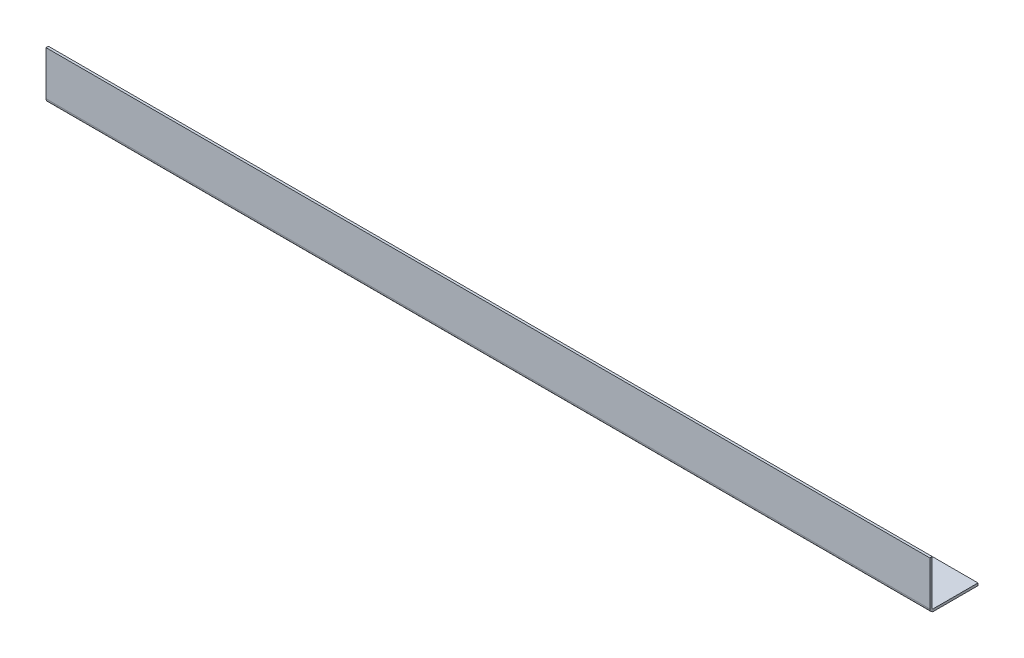
ISO-10303-21;
HEADER;
FILE_DESCRIPTION(('STEP AP214'),'2;1');
FILE_NAME('part.step','',(''),(''),'','','');
FILE_SCHEMA(('AUTOMOTIVE_DESIGN { 1 0 10303 214 1 1 1 1 }'));
ENDSEC;
DATA;
#1=APPLICATION_CONTEXT('core data for automotive mechanical design processes');
#2=APPLICATION_PROTOCOL_DEFINITION('international standard','automotive_design',2000,#1);
#3=PRODUCT_CONTEXT('',#1,'mechanical');
#4=PRODUCT('Part','Part','',(#3));
#5=PRODUCT_RELATED_PRODUCT_CATEGORY('part','',(#4));
#6=PRODUCT_DEFINITION_FORMATION('','',#4);
#7=PRODUCT_DEFINITION_CONTEXT('part definition',#1,'design');
#8=PRODUCT_DEFINITION('design','',#6,#7);
#9=PRODUCT_DEFINITION_SHAPE('','',#8);
#10=(LENGTH_UNIT() NAMED_UNIT(*) SI_UNIT(.MILLI.,.METRE.));
#11=(NAMED_UNIT(*) PLANE_ANGLE_UNIT() SI_UNIT($,.RADIAN.));
#12=(NAMED_UNIT(*) SI_UNIT($,.STERADIAN.) SOLID_ANGLE_UNIT());
#13=UNCERTAINTY_MEASURE_WITH_UNIT(LENGTH_MEASURE(1.E-05),#10,'distance_accuracy_value','');
#14=(GEOMETRIC_REPRESENTATION_CONTEXT(3) GLOBAL_UNCERTAINTY_ASSIGNED_CONTEXT((#13)) GLOBAL_UNIT_ASSIGNED_CONTEXT((#10,
#11,#12)) REPRESENTATION_CONTEXT('',''));
#15=CARTESIAN_POINT('',(0.,0.,0.));
#16=DIRECTION('',(0.,0.,1.));
#17=DIRECTION('',(1.,0.,0.));
#18=AXIS2_PLACEMENT_3D('',#15,#16,#17);
#19=CARTESIAN_POINT('',(550.,0.,0.));
#20=DIRECTION('',(0.,1.,0.));
#21=DIRECTION('',(0.,0.,1.));
#22=AXIS2_PLACEMENT_3D('',#19,#20,#21);
#23=PLANE('',#22);
#24=DIRECTION('',(0.,0.,-1.));
#25=VECTOR('',#24,1.);
#26=CARTESIAN_POINT('',(550.,0.,0.));
#27=LINE('',#26,#25);
#28=CARTESIAN_POINT('',(550.,0.,-5.));
#29=VERTEX_POINT('',#28);
#30=CARTESIAN_POINT('',(550.,0.,-60.));
#31=VERTEX_POINT('',#30);
#32=EDGE_CURVE('E97',#29,#31,#27,.T.);
#33=ORIENTED_EDGE('',*,*,#32,.F.);
#34=DIRECTION('',(-1.,0.,0.));
#35=VECTOR('',#34,1.);
#36=CARTESIAN_POINT('',(550.,0.,-5.));
#37=LINE('',#36,#35);
#38=CARTESIAN_POINT('',(-550.,0.,-5.));
#39=VERTEX_POINT('',#38);
#40=EDGE_CURVE('E122',#29,#39,#37,.T.);
#41=ORIENTED_EDGE('',*,*,#40,.T.);
#42=DIRECTION('',(0.,0.,-1.));
#43=VECTOR('',#42,1.);
#44=CARTESIAN_POINT('',(-550.,0.,0.));
#45=LINE('',#44,#43);
#46=CARTESIAN_POINT('',(-550.,0.,-60.));
#47=VERTEX_POINT('',#46);
#48=EDGE_CURVE('E120',#39,#47,#45,.T.);
#49=ORIENTED_EDGE('',*,*,#48,.T.);
#50=DIRECTION('',(-1.,0.,0.));
#51=VECTOR('',#50,1.);
#52=CARTESIAN_POINT('',(550.,0.,-60.));
#53=LINE('',#52,#51);
#54=EDGE_CURVE('E114',#31,#47,#53,.T.);
#55=ORIENTED_EDGE('',*,*,#54,.F.);
#56=EDGE_LOOP('',(#33,#41,#49,#55));
#57=FACE_BOUND('',#56,.T.);
#58=ADVANCED_FACE('F33',(#57),#23,.F.);
#59=CARTESIAN_POINT('',(550.,0.,-60.));
#60=DIRECTION('',(0.,0.,1.));
#61=DIRECTION('',(1.,0.,0.));
#62=AXIS2_PLACEMENT_3D('',#59,#60,#61);
#63=PLANE('',#62);
#64=DIRECTION('',(0.,1.,0.));
#65=VECTOR('',#64,1.);
#66=CARTESIAN_POINT('',(-550.,0.,-60.));
#67=LINE('',#66,#65);
#68=CARTESIAN_POINT('',(-550.,3.,-60.));
#69=VERTEX_POINT('',#68);
#70=EDGE_CURVE('E154',#47,#69,#67,.T.);
#71=ORIENTED_EDGE('',*,*,#70,.T.);
#72=DIRECTION('',(-1.,0.,0.));
#73=VECTOR('',#72,1.);
#74=CARTESIAN_POINT('',(550.,3.,-60.));
#75=LINE('',#74,#73);
#76=CARTESIAN_POINT('',(550.,3.,-60.));
#77=VERTEX_POINT('',#76);
#78=EDGE_CURVE('E116',#77,#69,#75,.T.);
#79=ORIENTED_EDGE('',*,*,#78,.F.);
#80=DIRECTION('',(0.,1.,0.));
#81=VECTOR('',#80,1.);
#82=CARTESIAN_POINT('',(550.,0.,-60.));
#83=LINE('',#82,#81);
#84=EDGE_CURVE('E101',#31,#77,#83,.T.);
#85=ORIENTED_EDGE('',*,*,#84,.F.);
#86=ORIENTED_EDGE('',*,*,#54,.T.);
#87=EDGE_LOOP('',(#71,#79,#85,#86));
#88=FACE_BOUND('',#87,.T.);
#89=ADVANCED_FACE('F113',(#88),#63,.F.);
#90=CARTESIAN_POINT('',(550.,3.,-60.));
#91=DIRECTION('',(0.,-1.,0.));
#92=DIRECTION('',(0.,0.,-1.));
#93=AXIS2_PLACEMENT_3D('',#90,#91,#92);
#94=PLANE('',#93);
#95=DIRECTION('',(0.,0.,1.));
#96=VECTOR('',#95,1.);
#97=CARTESIAN_POINT('',(-550.,3.,-60.));
#98=LINE('',#97,#96);
#99=CARTESIAN_POINT('',(-550.,2.99999999999999,-4.));
#100=VERTEX_POINT('',#99);
#101=EDGE_CURVE('E151',#69,#100,#98,.T.);
#102=ORIENTED_EDGE('',*,*,#101,.T.);
#103=DIRECTION('',(-1.,0.,0.));
#104=VECTOR('',#103,1.);
#105=CARTESIAN_POINT('',(550.,2.99999999999999,-4.));
#106=LINE('',#105,#104);
#107=CARTESIAN_POINT('',(550.,2.99999999999999,-4.));
#108=VERTEX_POINT('',#107);
#109=EDGE_CURVE('E48',#100,#108,#106,.F.);
#110=ORIENTED_EDGE('',*,*,#109,.T.);
#111=DIRECTION('',(0.,0.,1.));
#112=VECTOR('',#111,1.);
#113=CARTESIAN_POINT('',(550.,3.,-60.));
#114=LINE('',#113,#112);
#115=EDGE_CURVE('E117',#77,#108,#114,.T.);
#116=ORIENTED_EDGE('',*,*,#115,.F.);
#117=ORIENTED_EDGE('',*,*,#78,.T.);
#118=EDGE_LOOP('',(#102,#110,#116,#117));
#119=FACE_BOUND('',#118,.T.);
#120=ADVANCED_FACE('F174',(#119),#94,.F.);
#121=CARTESIAN_POINT('',(550.,2.99999999999999,-3.));
#122=DIRECTION('',(0.,0.,1.));
#123=DIRECTION('',(0.,-1.,0.));
#124=AXIS2_PLACEMENT_3D('',#121,#122,#123);
#125=PLANE('',#124);
#126=DIRECTION('',(0.,1.,0.));
#127=VECTOR('',#126,1.);
#128=CARTESIAN_POINT('',(550.,2.99999999999999,-3.));
#129=LINE('',#128,#127);
#130=CARTESIAN_POINT('',(550.,3.99999999999999,-3.));
#131=VERTEX_POINT('',#130);
#132=CARTESIAN_POINT('',(550.,60.,-3.));
#133=VERTEX_POINT('',#132);
#134=EDGE_CURVE('E144',#131,#133,#129,.T.);
#135=ORIENTED_EDGE('',*,*,#134,.F.);
#136=DIRECTION('',(-1.,0.,0.));
#137=VECTOR('',#136,1.);
#138=CARTESIAN_POINT('',(-550.,3.99999999999999,-3.));
#139=LINE('',#138,#137);
#140=CARTESIAN_POINT('',(-550.,3.99999999999999,-3.));
#141=VERTEX_POINT('',#140);
#142=EDGE_CURVE('E134',#131,#141,#139,.T.);
#143=ORIENTED_EDGE('',*,*,#142,.T.);
#144=DIRECTION('',(0.,1.,0.));
#145=VECTOR('',#144,1.);
#146=CARTESIAN_POINT('',(-550.,2.99999999999999,-3.));
#147=LINE('',#146,#145);
#148=CARTESIAN_POINT('',(-550.,60.,-3.));
#149=VERTEX_POINT('',#148);
#150=EDGE_CURVE('E142',#141,#149,#147,.T.);
#151=ORIENTED_EDGE('',*,*,#150,.T.);
#152=DIRECTION('',(-1.,0.,0.));
#153=VECTOR('',#152,1.);
#154=CARTESIAN_POINT('',(550.,60.,-3.));
#155=LINE('',#154,#153);
#156=EDGE_CURVE('E126',#133,#149,#155,.T.);
#157=ORIENTED_EDGE('',*,*,#156,.F.);
#158=EDGE_LOOP('',(#135,#143,#151,#157));
#159=FACE_BOUND('',#158,.T.);
#160=ADVANCED_FACE('F140',(#159),#125,.F.);
#161=CARTESIAN_POINT('',(550.,60.,-3.));
#162=DIRECTION('',(0.,-1.,0.));
#163=DIRECTION('',(0.,0.,-1.));
#164=AXIS2_PLACEMENT_3D('',#161,#162,#163);
#165=PLANE('',#164);
#166=DIRECTION('',(0.,0.,1.));
#167=VECTOR('',#166,1.);
#168=CARTESIAN_POINT('',(-550.,60.,-3.));
#169=LINE('',#168,#167);
#170=CARTESIAN_POINT('',(-550.,60.,0.));
#171=VERTEX_POINT('',#170);
#172=EDGE_CURVE('E150',#149,#171,#169,.T.);
#173=ORIENTED_EDGE('',*,*,#172,.T.);
#174=DIRECTION('',(-1.,0.,0.));
#175=VECTOR('',#174,1.);
#176=CARTESIAN_POINT('',(550.,60.,0.));
#177=LINE('',#176,#175);
#178=CARTESIAN_POINT('',(550.,60.,0.));
#179=VERTEX_POINT('',#178);
#180=EDGE_CURVE('E160',#179,#171,#177,.T.);
#181=ORIENTED_EDGE('',*,*,#180,.F.);
#182=DIRECTION('',(0.,0.,1.));
#183=VECTOR('',#182,1.);
#184=CARTESIAN_POINT('',(550.,60.,-3.));
#185=LINE('',#184,#183);
#186=EDGE_CURVE('E167',#133,#179,#185,.T.);
#187=ORIENTED_EDGE('',*,*,#186,.F.);
#188=ORIENTED_EDGE('',*,*,#156,.T.);
#189=EDGE_LOOP('',(#173,#181,#187,#188));
#190=FACE_BOUND('',#189,.T.);
#191=ADVANCED_FACE('F165',(#190),#165,.F.);
#192=CARTESIAN_POINT('',(550.,0.,0.));
#193=DIRECTION('',(0.,0.,-1.));
#194=DIRECTION('',(-1.,0.,0.));
#195=AXIS2_PLACEMENT_3D('',#192,#193,#194);
#196=PLANE('',#195);
#197=DIRECTION('',(0.,-1.,0.));
#198=VECTOR('',#197,1.);
#199=CARTESIAN_POINT('',(-550.,0.,0.));
#200=LINE('',#199,#198);
#201=CARTESIAN_POINT('',(-550.,5.,0.));
#202=VERTEX_POINT('',#201);
#203=EDGE_CURVE('E109',#171,#202,#200,.T.);
#204=ORIENTED_EDGE('',*,*,#203,.T.);
#205=DIRECTION('',(-1.,0.,0.));
#206=VECTOR('',#205,1.);
#207=CARTESIAN_POINT('',(550.,5.,0.));
#208=LINE('',#207,#206);
#209=CARTESIAN_POINT('',(550.,5.,0.));
#210=VERTEX_POINT('',#209);
#211=EDGE_CURVE('E131',#202,#210,#208,.F.);
#212=ORIENTED_EDGE('',*,*,#211,.T.);
#213=DIRECTION('',(0.,-1.,0.));
#214=VECTOR('',#213,1.);
#215=CARTESIAN_POINT('',(550.,0.,0.));
#216=LINE('',#215,#214);
#217=EDGE_CURVE('E162',#179,#210,#216,.T.);
#218=ORIENTED_EDGE('',*,*,#217,.F.);
#219=ORIENTED_EDGE('',*,*,#180,.T.);
#220=EDGE_LOOP('',(#204,#212,#218,#219));
#221=FACE_BOUND('',#220,.T.);
#222=ADVANCED_FACE('F194',(#221),#196,.F.);
#223=CARTESIAN_POINT('',(550.,0.,0.));
#224=DIRECTION('',(1.,0.,0.));
#225=DIRECTION('',(0.,0.,-1.));
#226=AXIS2_PLACEMENT_3D('',#223,#224,#225);
#227=PLANE('',#226);
#228=ORIENTED_EDGE('',*,*,#217,.T.);
#229=CARTESIAN_POINT('',(550.,5.,-5.));
#230=DIRECTION('',(1.,0.,0.));
#231=DIRECTION('',(0.,0.,-1.));
#232=AXIS2_PLACEMENT_3D('',#229,#230,#231);
#233=CIRCLE('',#232,5.);
#234=EDGE_CURVE('E104',#210,#29,#233,.T.);
#235=ORIENTED_EDGE('',*,*,#234,.T.);
#236=ORIENTED_EDGE('',*,*,#32,.T.);
#237=ORIENTED_EDGE('',*,*,#84,.T.);
#238=ORIENTED_EDGE('',*,*,#115,.T.);
#239=CARTESIAN_POINT('',(550.,3.99999999999999,-4.));
#240=DIRECTION('',(1.,0.,0.));
#241=DIRECTION('',(0.,0.,-1.));
#242=AXIS2_PLACEMENT_3D('',#239,#240,#241);
#243=CIRCLE('',#242,1.);
#244=EDGE_CURVE('E11',#108,#131,#243,.F.);
#245=ORIENTED_EDGE('',*,*,#244,.T.);
#246=ORIENTED_EDGE('',*,*,#134,.T.);
#247=ORIENTED_EDGE('',*,*,#186,.T.);
#248=EDGE_LOOP('',(#228,#235,#236,#237,#238,#245,#246,#247));
#249=FACE_BOUND('',#248,.T.);
#250=ADVANCED_FACE('F100',(#249),#227,.T.);
#251=CARTESIAN_POINT('',(-550.,0.,0.));
#252=DIRECTION('',(1.,0.,0.));
#253=DIRECTION('',(0.,0.,-1.));
#254=AXIS2_PLACEMENT_3D('',#251,#252,#253);
#255=PLANE('',#254);
#256=ORIENTED_EDGE('',*,*,#48,.F.);
#257=CARTESIAN_POINT('',(-550.,5.,-5.));
#258=DIRECTION('',(1.,0.,0.));
#259=DIRECTION('',(0.,0.,-1.));
#260=AXIS2_PLACEMENT_3D('',#257,#258,#259);
#261=CIRCLE('',#260,5.);
#262=EDGE_CURVE('E124',#39,#202,#261,.F.);
#263=ORIENTED_EDGE('',*,*,#262,.T.);
#264=ORIENTED_EDGE('',*,*,#203,.F.);
#265=ORIENTED_EDGE('',*,*,#172,.F.);
#266=ORIENTED_EDGE('',*,*,#150,.F.);
#267=CARTESIAN_POINT('',(-550.,3.99999999999999,-4.));
#268=DIRECTION('',(1.,0.,0.));
#269=DIRECTION('',(0.,0.,-1.));
#270=AXIS2_PLACEMENT_3D('',#267,#268,#269);
#271=CIRCLE('',#270,1.);
#272=EDGE_CURVE('E41',#141,#100,#271,.T.);
#273=ORIENTED_EDGE('',*,*,#272,.T.);
#274=ORIENTED_EDGE('',*,*,#101,.F.);
#275=ORIENTED_EDGE('',*,*,#70,.F.);
#276=EDGE_LOOP('',(#256,#263,#264,#265,#266,#273,#274,#275));
#277=FACE_BOUND('',#276,.T.);
#278=ADVANCED_FACE('F148',(#277),#255,.F.);
#279=CARTESIAN_POINT('',(550.,5.,-5.));
#280=DIRECTION('',(-1.,0.,0.));
#281=DIRECTION('',(0.,0.,1.));
#282=AXIS2_PLACEMENT_3D('',#279,#280,#281);
#283=CYLINDRICAL_SURFACE('',#282,5.);
#284=ORIENTED_EDGE('',*,*,#234,.F.);
#285=ORIENTED_EDGE('',*,*,#211,.F.);
#286=ORIENTED_EDGE('',*,*,#262,.F.);
#287=ORIENTED_EDGE('',*,*,#40,.F.);
#288=EDGE_LOOP('',(#284,#285,#286,#287));
#289=FACE_BOUND('',#288,.T.);
#290=ADVANCED_FACE('F176',(#289),#283,.T.);
#291=CARTESIAN_POINT('',(550.,3.99999999999999,-4.));
#292=DIRECTION('',(1.,0.,0.));
#293=DIRECTION('',(0.,0.,-1.));
#294=AXIS2_PLACEMENT_3D('',#291,#292,#293);
#295=CYLINDRICAL_SURFACE('',#294,1.);
#296=ORIENTED_EDGE('',*,*,#244,.F.);
#297=ORIENTED_EDGE('',*,*,#109,.F.);
#298=ORIENTED_EDGE('',*,*,#272,.F.);
#299=ORIENTED_EDGE('',*,*,#142,.F.);
#300=EDGE_LOOP('',(#296,#297,#298,#299));
#301=FACE_BOUND('',#300,.T.);
#302=ADVANCED_FACE('F35',(#301),#295,.F.);
#303=CLOSED_SHELL('',(#58,#89,#120,#160,#191,#222,#250,#278,#290,#302));
#304=MANIFOLD_SOLID_BREP('B2',#303);
#305=ADVANCED_BREP_SHAPE_REPRESENTATION('',(#18,#304),#14);
#306=SHAPE_DEFINITION_REPRESENTATION(#9,#305);
ENDSEC;
END-ISO-10303-21;
